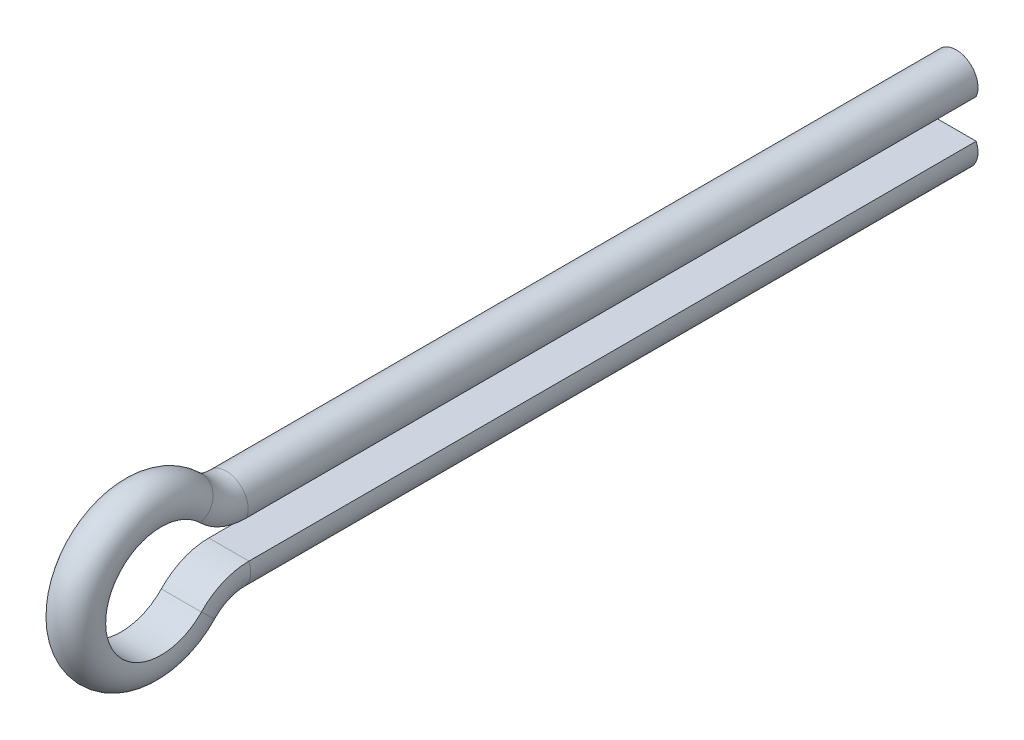
ISO-10303-21;
HEADER;
FILE_DESCRIPTION(('STEP AP214'),'2;1');
FILE_NAME('part.step','',(''),(''),'','','');
FILE_SCHEMA(('AUTOMOTIVE_DESIGN { 1 0 10303 214 1 1 1 1 }'));
ENDSEC;
DATA;
#1=APPLICATION_CONTEXT('core data for automotive mechanical design processes');
#2=APPLICATION_PROTOCOL_DEFINITION('international standard','automotive_design',2000,#1);
#3=PRODUCT_CONTEXT('',#1,'mechanical');
#4=PRODUCT('Part','Part','',(#3));
#5=PRODUCT_RELATED_PRODUCT_CATEGORY('part','',(#4));
#6=PRODUCT_DEFINITION_FORMATION('','',#4);
#7=PRODUCT_DEFINITION_CONTEXT('part definition',#1,'design');
#8=PRODUCT_DEFINITION('design','',#6,#7);
#9=PRODUCT_DEFINITION_SHAPE('','',#8);
#10=(LENGTH_UNIT() NAMED_UNIT(*) SI_UNIT(.MILLI.,.METRE.));
#11=(NAMED_UNIT(*) PLANE_ANGLE_UNIT() SI_UNIT($,.RADIAN.));
#12=(NAMED_UNIT(*) SI_UNIT($,.STERADIAN.) SOLID_ANGLE_UNIT());
#13=UNCERTAINTY_MEASURE_WITH_UNIT(LENGTH_MEASURE(1.E-05),#10,'distance_accuracy_value','');
#14=(GEOMETRIC_REPRESENTATION_CONTEXT(3) GLOBAL_UNCERTAINTY_ASSIGNED_CONTEXT((#13)) GLOBAL_UNIT_ASSIGNED_CONTEXT((#10,
#11,#12)) REPRESENTATION_CONTEXT('',''));
#15=CARTESIAN_POINT('',(0.,0.,0.));
#16=DIRECTION('',(0.,0.,1.));
#17=DIRECTION('',(1.,0.,0.));
#18=AXIS2_PLACEMENT_3D('',#15,#16,#17);
#19=CARTESIAN_POINT('',(0.,-6.11330923890086,-146.76971361475));
#20=DIRECTION('',(0.,0.,1.));
#21=DIRECTION('',(-1.,0.,0.));
#22=AXIS2_PLACEMENT_3D('',#19,#20,#21);
#23=PLANE('',#22);
#24=CARTESIAN_POINT('',(0.,-6.11330923890086,-146.76971361475));
#25=DIRECTION('',(0.,0.,1.));
#26=DIRECTION('',(-1.,0.,0.));
#27=AXIS2_PLACEMENT_3D('',#24,#25,#26);
#28=CIRCLE('',#27,5.);
#29=CARTESIAN_POINT('',(-4.58257569495584,-4.11330923890086,-146.76971361475));
#30=VERTEX_POINT('',#29);
#31=CARTESIAN_POINT('',(4.58257569495584,-4.11330923890086,-146.76971361475));
#32=VERTEX_POINT('',#31);
#33=EDGE_CURVE('E79',#30,#32,#28,.T.);
#34=ORIENTED_EDGE('',*,*,#33,.F.);
#35=DIRECTION('',(-1.,0.,0.));
#36=VECTOR('',#35,1.);
#37=CARTESIAN_POINT('',(4.58257569495584,-4.11330923890086,-146.76971361475));
#38=LINE('',#37,#36);
#39=EDGE_CURVE('E81',#32,#30,#38,.T.);
#40=ORIENTED_EDGE('',*,*,#39,.F.);
#41=EDGE_LOOP('',(#34,#40));
#42=FACE_BOUND('',#41,.T.);
#43=ADVANCED_FACE('F33',(#42),#23,.F.);
#44=CARTESIAN_POINT('',(0.,6.70983902612278,-146.76971361475));
#45=DIRECTION('',(0.,0.,-1.));
#46=DIRECTION('',(-1.,0.,0.));
#47=AXIS2_PLACEMENT_3D('',#44,#45,#46);
#48=PLANE('',#47);
#49=CARTESIAN_POINT('',(0.,6.70983902612278,-146.76971361475));
#50=DIRECTION('',(0.,0.,-1.));
#51=DIRECTION('',(-1.,0.,0.));
#52=AXIS2_PLACEMENT_3D('',#49,#50,#51);
#53=CIRCLE('',#52,5.);
#54=CARTESIAN_POINT('',(-4.58257569495584,4.70983902612278,-146.76971361475));
#55=VERTEX_POINT('',#54);
#56=CARTESIAN_POINT('',(4.58257569495584,4.70983902612278,-146.76971361475));
#57=VERTEX_POINT('',#56);
#58=EDGE_CURVE('E45',#55,#57,#53,.T.);
#59=ORIENTED_EDGE('',*,*,#58,.T.);
#60=DIRECTION('',(-1.,0.,0.));
#61=VECTOR('',#60,1.);
#62=CARTESIAN_POINT('',(4.58257569495584,4.70983902612278,-146.76971361475));
#63=LINE('',#62,#61);
#64=EDGE_CURVE('E11',#57,#55,#63,.T.);
#65=ORIENTED_EDGE('',*,*,#64,.T.);
#66=EDGE_LOOP('',(#59,#65));
#67=FACE_BOUND('',#66,.T.);
#68=ADVANCED_FACE('F184',(#67),#48,.T.);
#69=CARTESIAN_POINT('',(0.,-6.11330923890086,-146.76971361475));
#70=DIRECTION('',(0.,0.,1.));
#71=DIRECTION('',(1.,0.,0.));
#72=AXIS2_PLACEMENT_3D('',#69,#70,#71);
#73=CYLINDRICAL_SURFACE('',#72,5.);
#74=DIRECTION('',(0.,0.,1.));
#75=VECTOR('',#74,1.);
#76=CARTESIAN_POINT('',(4.58257569495584,-4.11330923890086,-146.76971361475));
#77=LINE('',#76,#75);
#78=CARTESIAN_POINT('',(4.58257569495584,-4.11330923890086,19.4968233425197));
#79=VERTEX_POINT('',#78);
#80=EDGE_CURVE('E92',#32,#79,#77,.T.);
#81=ORIENTED_EDGE('',*,*,#80,.T.);
#82=CARTESIAN_POINT('',(0.,-6.11330923890086,19.4968233425197));
#83=DIRECTION('',(0.,0.,1.));
#84=DIRECTION('',(-1.,0.,0.));
#85=AXIS2_PLACEMENT_3D('',#82,#83,#84);
#86=CIRCLE('',#85,5.);
#87=CARTESIAN_POINT('',(-4.58257569495584,-4.11330923890086,19.4968233425197));
#88=VERTEX_POINT('',#87);
#89=EDGE_CURVE('E97',#88,#79,#86,.T.);
#90=ORIENTED_EDGE('',*,*,#89,.F.);
#91=DIRECTION('',(0.,0.,1.));
#92=VECTOR('',#91,1.);
#93=CARTESIAN_POINT('',(-4.58257569495584,-4.11330923890086,-146.76971361475));
#94=LINE('',#93,#92);
#95=EDGE_CURVE('E91',#30,#88,#94,.T.);
#96=ORIENTED_EDGE('',*,*,#95,.F.);
#97=ORIENTED_EDGE('',*,*,#33,.T.);
#98=EDGE_LOOP('',(#81,#90,#96,#97));
#99=FACE_BOUND('',#98,.T.);
#100=ADVANCED_FACE('F95',(#99),#73,.T.);
#101=CARTESIAN_POINT('',(4.58257569495584,-4.11330923890086,-146.76971361475));
#102=DIRECTION('',(0.,1.,0.));
#103=DIRECTION('',(-1.,0.,0.));
#104=AXIS2_PLACEMENT_3D('',#101,#102,#103);
#105=PLANE('',#104);
#106=DIRECTION('',(-1.,0.,0.));
#107=VECTOR('',#106,1.);
#108=CARTESIAN_POINT('',(4.58257569495584,-4.11330923890086,19.4968233425197));
#109=LINE('',#108,#107);
#110=EDGE_CURVE('E112',#79,#88,#109,.T.);
#111=ORIENTED_EDGE('',*,*,#110,.F.);
#112=ORIENTED_EDGE('',*,*,#80,.F.);
#113=ORIENTED_EDGE('',*,*,#39,.T.);
#114=ORIENTED_EDGE('',*,*,#95,.T.);
#115=EDGE_LOOP('',(#111,#112,#113,#114));
#116=FACE_BOUND('',#115,.T.);
#117=ADVANCED_FACE('F90',(#116),#105,.T.);
#118=CARTESIAN_POINT('',(0.,-19.1177332531153,19.4968233425197));
#119=DIRECTION('',(1.,0.,0.));
#120=DIRECTION('',(0.,0.,-1.));
#121=AXIS2_PLACEMENT_3D('',#118,#119,#120);
#122=TOROIDAL_SURFACE('',#121,13.0044240142144,5.);
#123=CARTESIAN_POINT('',(4.58257569495584,-19.1177332531153,19.4968233425197));
#124=DIRECTION('',(1.,0.,0.));
#125=DIRECTION('',(0.,1.,0.));
#126=AXIS2_PLACEMENT_3D('',#123,#124,#125);
#127=CIRCLE('',#126,15.0044240142144);
#128=CARTESIAN_POINT('',(4.58257569495584,-8.76211679389549,30.3547212858543));
#129=VERTEX_POINT('',#128);
#130=EDGE_CURVE('E105',#79,#129,#127,.T.);
#131=ORIENTED_EDGE('',*,*,#130,.T.);
#132=CARTESIAN_POINT('',(0.,-10.1424585450229,28.9074284163582));
#133=DIRECTION('',(0.,-0.723646434748074,0.690170875563728));
#134=DIRECTION('',(-1.,0.,0.));
#135=AXIS2_PLACEMENT_3D('',#132,#133,#134);
#136=CIRCLE('',#135,5.);
#137=CARTESIAN_POINT('',(-4.58257569495584,-8.76211679389549,30.3547212858543));
#138=VERTEX_POINT('',#137);
#139=EDGE_CURVE('E102',#138,#129,#136,.T.);
#140=ORIENTED_EDGE('',*,*,#139,.F.);
#141=CARTESIAN_POINT('',(-4.58257569495584,-19.1177332531153,19.4968233425197));
#142=DIRECTION('',(1.,0.,0.));
#143=DIRECTION('',(0.,1.,0.));
#144=AXIS2_PLACEMENT_3D('',#141,#142,#143);
#145=CIRCLE('',#144,15.0044240142144);
#146=EDGE_CURVE('E106',#88,#138,#145,.T.);
#147=ORIENTED_EDGE('',*,*,#146,.F.);
#148=ORIENTED_EDGE('',*,*,#89,.T.);
#149=EDGE_LOOP('',(#131,#140,#147,#148));
#150=FACE_BOUND('',#149,.T.);
#151=ADVANCED_FACE('F164',(#150),#122,.T.);
#152=CARTESIAN_POINT('',(0.,-19.1177332531153,19.4968233425197));
#153=DIRECTION('',(1.,0.,0.));
#154=DIRECTION('',(0.,0.,-1.));
#155=AXIS2_PLACEMENT_3D('',#152,#153,#154);
#156=CYLINDRICAL_SURFACE('',#155,15.0044240142144);
#157=DIRECTION('',(-1.,0.,0.));
#158=VECTOR('',#157,1.);
#159=CARTESIAN_POINT('',(4.58257569495584,-8.76211679389549,30.3547212858543));
#160=LINE('',#159,#158);
#161=EDGE_CURVE('E109',#129,#138,#160,.T.);
#162=ORIENTED_EDGE('',*,*,#161,.F.);
#163=ORIENTED_EDGE('',*,*,#130,.F.);
#164=ORIENTED_EDGE('',*,*,#110,.T.);
#165=ORIENTED_EDGE('',*,*,#146,.T.);
#166=EDGE_LOOP('',(#162,#163,#164,#165));
#167=FACE_BOUND('',#166,.T.);
#168=ADVANCED_FACE('F165',(#167),#156,.T.);
#169=CARTESIAN_POINT('',(0.,0.,39.5418295850414));
#170=DIRECTION('',(-1.,0.,0.));
#171=DIRECTION('',(0.,0.,1.));
#172=AXIS2_PLACEMENT_3D('',#169,#170,#171);
#173=TOROIDAL_SURFACE('',#172,14.6955759857856,5.);
#174=CARTESIAN_POINT('',(4.58257569495584,0.,39.5418295850414));
#175=DIRECTION('',(-1.,0.,0.));
#176=DIRECTION('',(0.,-0.690170875563728,-0.723646434748073));
#177=AXIS2_PLACEMENT_3D('',#174,#175,#176);
#178=CIRCLE('',#177,12.6955759857856);
#179=CARTESIAN_POINT('',(4.58257569495584,9.03552073763052,30.6234769002287));
#180=VERTEX_POINT('',#179);
#181=EDGE_CURVE('E116',#129,#180,#178,.T.);
#182=ORIENTED_EDGE('',*,*,#181,.T.);
#183=CARTESIAN_POINT('',(0.,10.4589332315177,29.2185224980341));
#184=DIRECTION('',(0.,-0.70247720109729,-0.711706246943581));
#185=DIRECTION('',(-1.,0.,0.));
#186=AXIS2_PLACEMENT_3D('',#183,#184,#185);
#187=CIRCLE('',#186,5.);
#188=CARTESIAN_POINT('',(-4.58257569495584,9.03552073763052,30.6234769002287));
#189=VERTEX_POINT('',#188);
#190=EDGE_CURVE('E113',#189,#180,#187,.T.);
#191=ORIENTED_EDGE('',*,*,#190,.F.);
#192=CARTESIAN_POINT('',(-4.58257569495584,0.,39.5418295850414));
#193=DIRECTION('',(-1.,0.,0.));
#194=DIRECTION('',(0.,-0.690170875563728,-0.723646434748073));
#195=AXIS2_PLACEMENT_3D('',#192,#193,#194);
#196=CIRCLE('',#195,12.6955759857856);
#197=EDGE_CURVE('E117',#138,#189,#196,.T.);
#198=ORIENTED_EDGE('',*,*,#197,.F.);
#199=ORIENTED_EDGE('',*,*,#139,.T.);
#200=EDGE_LOOP('',(#182,#191,#198,#199));
#201=FACE_BOUND('',#200,.T.);
#202=ADVANCED_FACE('F158',(#201),#173,.T.);
#203=CARTESIAN_POINT('',(0.,0.,39.5418295850414));
#204=DIRECTION('',(-1.,0.,0.));
#205=DIRECTION('',(0.,0.,1.));
#206=AXIS2_PLACEMENT_3D('',#203,#204,#205);
#207=CYLINDRICAL_SURFACE('',#206,12.6955759857856);
#208=DIRECTION('',(-1.,0.,0.));
#209=VECTOR('',#208,1.);
#210=CARTESIAN_POINT('',(4.58257569495584,9.03552073763052,30.6234769002287));
#211=LINE('',#210,#209);
#212=EDGE_CURVE('E120',#180,#189,#211,.T.);
#213=ORIENTED_EDGE('',*,*,#212,.F.);
#214=ORIENTED_EDGE('',*,*,#181,.F.);
#215=ORIENTED_EDGE('',*,*,#161,.T.);
#216=ORIENTED_EDGE('',*,*,#197,.T.);
#217=EDGE_LOOP('',(#213,#214,#215,#216));
#218=FACE_BOUND('',#217,.T.);
#219=ADVANCED_FACE('F159',(#218),#207,.F.);
#220=CARTESIAN_POINT('',(0.,19.7142630403372,20.0832111146464));
#221=DIRECTION('',(1.,0.,0.));
#222=DIRECTION('',(0.,0.,-1.));
#223=AXIS2_PLACEMENT_3D('',#220,#221,#222);
#224=TOROIDAL_SURFACE('',#223,13.0044240142144,5.);
#225=CARTESIAN_POINT('',(4.58257569495584,19.7142630403372,20.0832111146464));
#226=DIRECTION('',(1.,0.,0.));
#227=DIRECTION('',(0.,-0.71170624694358,0.702477201097291));
#228=AXIS2_PLACEMENT_3D('',#225,#226,#227);
#229=CIRCLE('',#228,15.0044240142144);
#230=CARTESIAN_POINT('',(4.58257569495584,4.70983902612279,20.0832111146464));
#231=VERTEX_POINT('',#230);
#232=EDGE_CURVE('E126',#180,#231,#229,.T.);
#233=ORIENTED_EDGE('',*,*,#232,.T.);
#234=CARTESIAN_POINT('',(0.,6.70983902612282,20.0832111146464));
#235=DIRECTION('',(0.,0.,-1.));
#236=DIRECTION('',(-1.,0.,0.));
#237=AXIS2_PLACEMENT_3D('',#234,#235,#236);
#238=CIRCLE('',#237,5.);
#239=CARTESIAN_POINT('',(-4.58257569495584,4.70983902612279,20.0832111146464));
#240=VERTEX_POINT('',#239);
#241=EDGE_CURVE('E123',#240,#231,#238,.T.);
#242=ORIENTED_EDGE('',*,*,#241,.F.);
#243=CARTESIAN_POINT('',(-4.58257569495584,19.7142630403372,20.0832111146464));
#244=DIRECTION('',(1.,0.,0.));
#245=DIRECTION('',(0.,-0.71170624694358,0.702477201097291));
#246=AXIS2_PLACEMENT_3D('',#243,#244,#245);
#247=CIRCLE('',#246,15.0044240142144);
#248=EDGE_CURVE('E127',#189,#240,#247,.T.);
#249=ORIENTED_EDGE('',*,*,#248,.F.);
#250=ORIENTED_EDGE('',*,*,#190,.T.);
#251=EDGE_LOOP('',(#233,#242,#249,#250));
#252=FACE_BOUND('',#251,.T.);
#253=ADVANCED_FACE('F151',(#252),#224,.T.);
#254=CARTESIAN_POINT('',(0.,19.7142630403372,20.0832111146464));
#255=DIRECTION('',(1.,0.,0.));
#256=DIRECTION('',(0.,0.,-1.));
#257=AXIS2_PLACEMENT_3D('',#254,#255,#256);
#258=CYLINDRICAL_SURFACE('',#257,15.0044240142144);
#259=DIRECTION('',(-1.,0.,0.));
#260=VECTOR('',#259,1.);
#261=CARTESIAN_POINT('',(4.58257569495584,4.70983902612282,20.0832111146464));
#262=LINE('',#261,#260);
#263=EDGE_CURVE('E130',#231,#240,#262,.T.);
#264=ORIENTED_EDGE('',*,*,#263,.F.);
#265=ORIENTED_EDGE('',*,*,#232,.F.);
#266=ORIENTED_EDGE('',*,*,#212,.T.);
#267=ORIENTED_EDGE('',*,*,#248,.T.);
#268=EDGE_LOOP('',(#264,#265,#266,#267));
#269=FACE_BOUND('',#268,.T.);
#270=ADVANCED_FACE('F153',(#269),#258,.T.);
#271=CARTESIAN_POINT('',(0.,6.70983902612278,20.0832111146464));
#272=DIRECTION('',(0.,0.,-1.));
#273=DIRECTION('',(-1.,0.,0.));
#274=AXIS2_PLACEMENT_3D('',#271,#272,#273);
#275=CYLINDRICAL_SURFACE('',#274,5.);
#276=DIRECTION('',(0.,0.,-1.));
#277=VECTOR('',#276,1.);
#278=CARTESIAN_POINT('',(4.58257569495584,4.70983902612278,20.0832111146464));
#279=LINE('',#278,#277);
#280=EDGE_CURVE('E40',#231,#57,#279,.T.);
#281=ORIENTED_EDGE('',*,*,#280,.T.);
#282=ORIENTED_EDGE('',*,*,#58,.F.);
#283=DIRECTION('',(0.,0.,-1.));
#284=VECTOR('',#283,1.);
#285=CARTESIAN_POINT('',(-4.58257569495584,4.70983902612278,20.0832111146464));
#286=LINE('',#285,#284);
#287=EDGE_CURVE('E134',#240,#55,#286,.T.);
#288=ORIENTED_EDGE('',*,*,#287,.F.);
#289=ORIENTED_EDGE('',*,*,#241,.T.);
#290=EDGE_LOOP('',(#281,#282,#288,#289));
#291=FACE_BOUND('',#290,.T.);
#292=ADVANCED_FACE('F177',(#291),#275,.T.);
#293=CARTESIAN_POINT('',(4.58257569495584,4.70983902612278,20.0832111146464));
#294=DIRECTION('',(0.,-1.,0.));
#295=DIRECTION('',(1.,0.,0.));
#296=AXIS2_PLACEMENT_3D('',#293,#294,#295);
#297=PLANE('',#296);
#298=ORIENTED_EDGE('',*,*,#64,.F.);
#299=ORIENTED_EDGE('',*,*,#280,.F.);
#300=ORIENTED_EDGE('',*,*,#263,.T.);
#301=ORIENTED_EDGE('',*,*,#287,.T.);
#302=EDGE_LOOP('',(#298,#299,#300,#301));
#303=FACE_BOUND('',#302,.T.);
#304=ADVANCED_FACE('F148',(#303),#297,.T.);
#305=CLOSED_SHELL('',(#43,#68,#100,#117,#151,#168,#202,#219,#253,#270,#292,#304));
#306=MANIFOLD_SOLID_BREP('B2',#305);
#307=ADVANCED_BREP_SHAPE_REPRESENTATION('',(#18,#306),#14);
#308=SHAPE_DEFINITION_REPRESENTATION(#9,#307);
ENDSEC;
END-ISO-10303-21;
